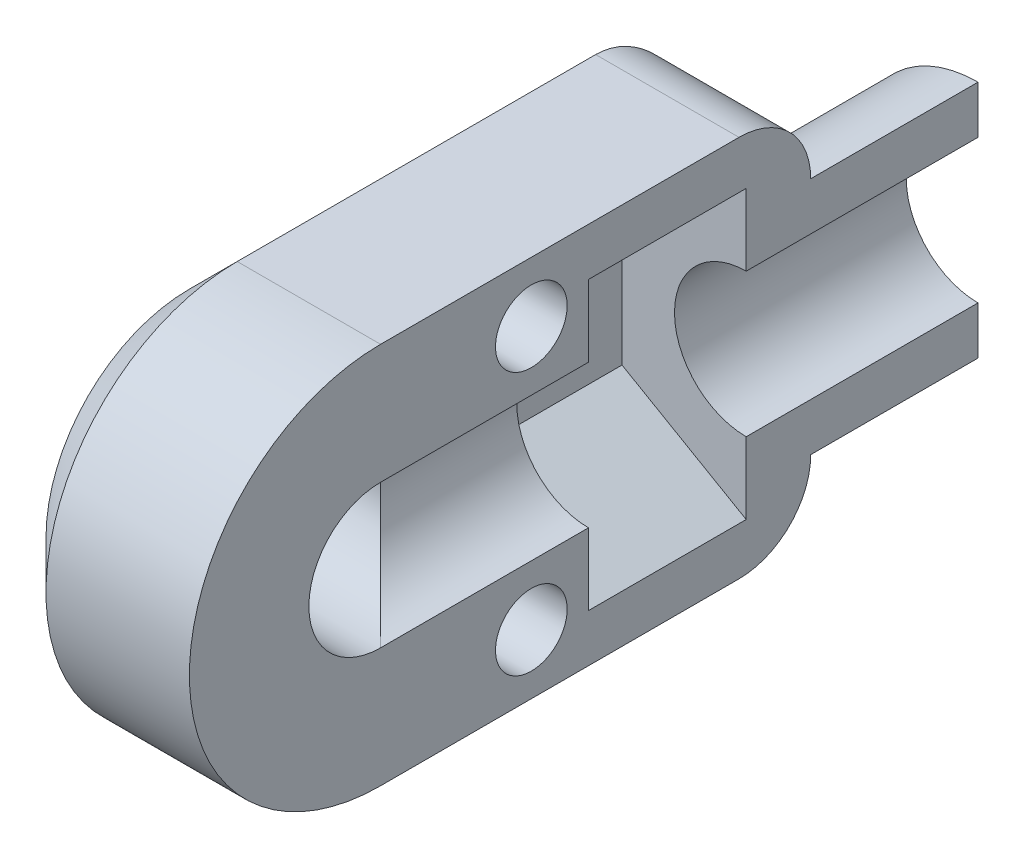
ISO-10303-21;
HEADER;
FILE_DESCRIPTION(('STEP AP214'),'2;1');
FILE_NAME('part.step','',(''),(''),'','','');
FILE_SCHEMA(('AUTOMOTIVE_DESIGN { 1 0 10303 214 1 1 1 1 }'));
ENDSEC;
DATA;
#1=APPLICATION_CONTEXT('core data for automotive mechanical design processes');
#2=APPLICATION_PROTOCOL_DEFINITION('international standard','automotive_design',2000,#1);
#3=PRODUCT_CONTEXT('',#1,'mechanical');
#4=PRODUCT('Part','Part','',(#3));
#5=PRODUCT_RELATED_PRODUCT_CATEGORY('part','',(#4));
#6=PRODUCT_DEFINITION_FORMATION('','',#4);
#7=PRODUCT_DEFINITION_CONTEXT('part definition',#1,'design');
#8=PRODUCT_DEFINITION('design','',#6,#7);
#9=PRODUCT_DEFINITION_SHAPE('','',#8);
#10=(LENGTH_UNIT() NAMED_UNIT(*) SI_UNIT(.MILLI.,.METRE.));
#11=(NAMED_UNIT(*) PLANE_ANGLE_UNIT() SI_UNIT($,.RADIAN.));
#12=(NAMED_UNIT(*) SI_UNIT($,.STERADIAN.) SOLID_ANGLE_UNIT());
#13=UNCERTAINTY_MEASURE_WITH_UNIT(LENGTH_MEASURE(1.E-05),#10,'distance_accuracy_value','');
#14=(GEOMETRIC_REPRESENTATION_CONTEXT(3) GLOBAL_UNCERTAINTY_ASSIGNED_CONTEXT((#13)) GLOBAL_UNIT_ASSIGNED_CONTEXT((#10,
#11,#12)) REPRESENTATION_CONTEXT('',''));
#15=CARTESIAN_POINT('',(0.,0.,0.));
#16=DIRECTION('',(0.,0.,1.));
#17=DIRECTION('',(1.,0.,0.));
#18=AXIS2_PLACEMENT_3D('',#15,#16,#17);
#19=CARTESIAN_POINT('',(0.,0.,-18.));
#20=DIRECTION('',(0.,0.,-1.));
#21=DIRECTION('',(-1.,0.,0.));
#22=AXIS2_PLACEMENT_3D('',#19,#20,#21);
#23=PLANE('',#22);
#24=CARTESIAN_POINT('',(8.,0.,-18.));
#25=DIRECTION('',(0.,0.,-1.));
#26=DIRECTION('',(-1.,0.,0.));
#27=AXIS2_PLACEMENT_3D('',#24,#25,#26);
#28=CIRCLE('',#27,5.);
#29=CARTESIAN_POINT('',(8.,-5.,-18.));
#30=VERTEX_POINT('',#29);
#31=CARTESIAN_POINT('',(3.,0.,-18.));
#32=VERTEX_POINT('',#31);
#33=EDGE_CURVE('E202',#30,#32,#28,.T.);
#34=ORIENTED_EDGE('',*,*,#33,.F.);
#35=DIRECTION('',(-1.,0.,0.));
#36=VECTOR('',#35,1.);
#37=CARTESIAN_POINT('',(2.,-5.,-18.));
#38=LINE('',#37,#36);
#39=CARTESIAN_POINT('',(3.24264068711929,-5.,-18.));
#40=VERTEX_POINT('',#39);
#41=EDGE_CURVE('E221',#30,#40,#38,.T.);
#42=ORIENTED_EDGE('',*,*,#41,.T.);
#43=DIRECTION('',(0.707106781186546,-0.707106781186549,0.));
#44=VECTOR('',#43,1.);
#45=CARTESIAN_POINT('',(-0.878679656440352,-0.878679656440349,-18.));
#46=LINE('',#45,#44);
#47=CARTESIAN_POINT('',(3.,-4.75735931288071,-18.));
#48=VERTEX_POINT('',#47);
#49=EDGE_CURVE('E369',#40,#48,#46,.F.);
#50=ORIENTED_EDGE('',*,*,#49,.T.);
#51=DIRECTION('',(0.,1.,0.));
#52=VECTOR('',#51,1.);
#53=CARTESIAN_POINT('',(3.,5.99999999999999,-18.));
#54=LINE('',#53,#52);
#55=EDGE_CURVE('E367',#48,#32,#54,.T.);
#56=ORIENTED_EDGE('',*,*,#55,.T.);
#57=EDGE_LOOP('',(#34,#42,#50,#56));
#58=FACE_BOUND('',#57,.T.);
#59=ADVANCED_FACE('F41',(#58),#23,.T.);
#60=CARTESIAN_POINT('',(16.,-8.,0.));
#61=DIRECTION('',(0.,1.,0.));
#62=DIRECTION('',(0.,0.,1.));
#63=AXIS2_PLACEMENT_3D('',#60,#61,#62);
#64=PLANE('',#63);
#65=DIRECTION('',(0.,0.,-1.));
#66=VECTOR('',#65,1.);
#67=CARTESIAN_POINT('',(2.,-8.,0.));
#68=LINE('',#67,#66);
#69=CARTESIAN_POINT('',(2.,-8.,0.));
#70=VERTEX_POINT('',#69);
#71=CARTESIAN_POINT('',(2.,-8.,-15.));
#72=VERTEX_POINT('',#71);
#73=EDGE_CURVE('E332',#70,#72,#68,.T.);
#74=ORIENTED_EDGE('',*,*,#73,.T.);
#75=DIRECTION('',(-1.,0.,0.));
#76=VECTOR('',#75,1.);
#77=CARTESIAN_POINT('',(8.,-8.,-15.));
#78=LINE('',#77,#76);
#79=CARTESIAN_POINT('',(8.,-8.,-15.));
#80=VERTEX_POINT('',#79);
#81=EDGE_CURVE('E217',#72,#80,#78,.F.);
#82=ORIENTED_EDGE('',*,*,#81,.T.);
#83=DIRECTION('',(0.,0.,1.));
#84=VECTOR('',#83,1.);
#85=CARTESIAN_POINT('',(8.,-8.,0.));
#86=LINE('',#85,#84);
#87=CARTESIAN_POINT('',(8.,-8.,0.));
#88=VERTEX_POINT('',#87);
#89=EDGE_CURVE('E300',#80,#88,#86,.T.);
#90=ORIENTED_EDGE('',*,*,#89,.T.);
#91=DIRECTION('',(-1.,0.,0.));
#92=VECTOR('',#91,1.);
#93=CARTESIAN_POINT('',(16.,-8.,0.));
#94=LINE('',#93,#92);
#95=EDGE_CURVE('E319',#88,#70,#94,.T.);
#96=ORIENTED_EDGE('',*,*,#95,.T.);
#97=EDGE_LOOP('',(#74,#82,#90,#96));
#98=FACE_BOUND('',#97,.T.);
#99=ADVANCED_FACE('F393',(#98),#64,.F.);
#100=CARTESIAN_POINT('',(16.,0.,-25.));
#101=DIRECTION('',(0.,0.,-1.));
#102=DIRECTION('',(-1.,0.,0.));
#103=AXIS2_PLACEMENT_3D('',#100,#101,#102);
#104=PLANE('',#103);
#105=DIRECTION('',(0.,1.,0.));
#106=VECTOR('',#105,1.);
#107=CARTESIAN_POINT('',(8.,-48.,-25.));
#108=LINE('',#107,#106);
#109=CARTESIAN_POINT('',(8.,-5.,-25.));
#110=VERTEX_POINT('',#109);
#111=CARTESIAN_POINT('',(8.,-3.,-25.));
#112=VERTEX_POINT('',#111);
#113=EDGE_CURVE('E296',#110,#112,#108,.T.);
#114=ORIENTED_EDGE('',*,*,#113,.F.);
#115=CARTESIAN_POINT('',(8.,0.,-25.));
#116=DIRECTION('',(0.,0.,-1.));
#117=DIRECTION('',(-1.,0.,0.));
#118=AXIS2_PLACEMENT_3D('',#115,#116,#117);
#119=CIRCLE('',#118,5.);
#120=CARTESIAN_POINT('',(8.,5.,-25.));
#121=VERTEX_POINT('',#120);
#122=EDGE_CURVE('E204',#110,#121,#119,.T.);
#123=ORIENTED_EDGE('',*,*,#122,.T.);
#124=CARTESIAN_POINT('',(8.,3.,-25.));
#125=VERTEX_POINT('',#124);
#126=EDGE_CURVE('E212',#125,#121,#108,.T.);
#127=ORIENTED_EDGE('',*,*,#126,.F.);
#128=CARTESIAN_POINT('',(8.,0.,-25.));
#129=DIRECTION('',(0.,0.,-1.));
#130=DIRECTION('',(-1.,0.,0.));
#131=AXIS2_PLACEMENT_3D('',#128,#129,#130);
#132=CIRCLE('',#131,3.);
#133=EDGE_CURVE('E306',#112,#125,#132,.T.);
#134=ORIENTED_EDGE('',*,*,#133,.F.);
#135=EDGE_LOOP('',(#114,#123,#127,#134));
#136=FACE_BOUND('',#135,.T.);
#137=ADVANCED_FACE('F398',(#136),#104,.T.);
#138=CARTESIAN_POINT('',(16.,8.,0.));
#139=DIRECTION('',(0.,1.,0.));
#140=DIRECTION('',(0.,0.,1.));
#141=AXIS2_PLACEMENT_3D('',#138,#139,#140);
#142=PLANE('',#141);
#143=DIRECTION('',(0.,0.,1.));
#144=VECTOR('',#143,1.);
#145=CARTESIAN_POINT('',(8.,8.,-25.));
#146=LINE('',#145,#144);
#147=CARTESIAN_POINT('',(8.,8.,-15.));
#148=VERTEX_POINT('',#147);
#149=CARTESIAN_POINT('',(8.,8.,0.));
#150=VERTEX_POINT('',#149);
#151=EDGE_CURVE('E293',#148,#150,#146,.T.);
#152=ORIENTED_EDGE('',*,*,#151,.F.);
#153=DIRECTION('',(1.,0.,0.));
#154=VECTOR('',#153,1.);
#155=CARTESIAN_POINT('',(16.,8.,-15.));
#156=LINE('',#155,#154);
#157=CARTESIAN_POINT('',(2.,8.,-15.));
#158=VERTEX_POINT('',#157);
#159=EDGE_CURVE('E11',#148,#158,#156,.F.);
#160=ORIENTED_EDGE('',*,*,#159,.T.);
#161=DIRECTION('',(0.,0.,1.));
#162=VECTOR('',#161,1.);
#163=CARTESIAN_POINT('',(2.,8.,0.));
#164=LINE('',#163,#162);
#165=CARTESIAN_POINT('',(2.,8.,0.));
#166=VERTEX_POINT('',#165);
#167=EDGE_CURVE('E330',#158,#166,#164,.T.);
#168=ORIENTED_EDGE('',*,*,#167,.T.);
#169=DIRECTION('',(-1.,0.,0.));
#170=VECTOR('',#169,1.);
#171=CARTESIAN_POINT('',(16.,8.,0.));
#172=LINE('',#171,#170);
#173=EDGE_CURVE('E315',#150,#166,#172,.T.);
#174=ORIENTED_EDGE('',*,*,#173,.F.);
#175=EDGE_LOOP('',(#152,#160,#168,#174));
#176=FACE_BOUND('',#175,.T.);
#177=ADVANCED_FACE('F467',(#176),#142,.T.);
#178=CARTESIAN_POINT('',(0.,0.,0.));
#179=DIRECTION('',(1.,0.,0.));
#180=DIRECTION('',(0.,0.,-1.));
#181=AXIS2_PLACEMENT_3D('',#178,#179,#180);
#182=PLANE('',#181);
#183=CARTESIAN_POINT('',(0.,0.,0.));
#184=DIRECTION('',(1.,0.,0.));
#185=DIRECTION('',(0.,0.,-1.));
#186=AXIS2_PLACEMENT_3D('',#183,#184,#185);
#187=CIRCLE('',#186,3.);
#188=CARTESIAN_POINT('',(0.,0.,-3.));
#189=VERTEX_POINT('',#188);
#190=EDGE_CURVE('E312',#189,#189,#187,.T.);
#191=ORIENTED_EDGE('',*,*,#190,.T.);
#192=EDGE_LOOP('',(#191));
#193=FACE_BOUND('',#192,.T.);
#194=DIRECTION('',(0.,0.,-1.));
#195=VECTOR('',#194,1.);
#196=CARTESIAN_POINT('',(0.,5.99999999999999,-25.));
#197=LINE('',#196,#195);
#198=CARTESIAN_POINT('',(0.,5.99999999999999,-8.24543648007678));
#199=VERTEX_POINT('',#198);
#200=CARTESIAN_POINT('',(0.,5.99999999999999,-15.));
#201=VERTEX_POINT('',#200);
#202=EDGE_CURVE('E326',#199,#201,#197,.T.);
#203=ORIENTED_EDGE('',*,*,#202,.T.);
#204=DIRECTION('',(0.,1.,0.));
#205=VECTOR('',#204,1.);
#206=CARTESIAN_POINT('',(0.,-5.99999999999999,-15.));
#207=LINE('',#206,#205);
#208=CARTESIAN_POINT('',(0.,-5.99999999999999,-15.));
#209=VERTEX_POINT('',#208);
#210=EDGE_CURVE('E226',#201,#209,#207,.F.);
#211=ORIENTED_EDGE('',*,*,#210,.T.);
#212=DIRECTION('',(0.,0.,1.));
#213=VECTOR('',#212,1.);
#214=CARTESIAN_POINT('',(0.,-5.99999999999999,0.));
#215=LINE('',#214,#213);
#216=CARTESIAN_POINT('',(0.,-5.99999999999999,-8.24543648007678));
#217=VERTEX_POINT('',#216);
#218=EDGE_CURVE('E324',#209,#217,#215,.T.);
#219=ORIENTED_EDGE('',*,*,#218,.T.);
#220=CARTESIAN_POINT('',(0.,-5.5,-6.30894480697307));
#221=DIRECTION('',(-1.,0.,0.));
#222=DIRECTION('',(0.,0.,-1.));
#223=AXIS2_PLACEMENT_3D('',#220,#221,#222);
#224=CIRCLE('',#223,2.);
#225=CARTESIAN_POINT('',(0.,-5.99999999999999,-4.37245313386936));
#226=VERTEX_POINT('',#225);
#227=EDGE_CURVE('E213',#226,#217,#224,.T.);
#228=ORIENTED_EDGE('',*,*,#227,.F.);
#229=CARTESIAN_POINT('',(0.,-5.99999999999999,0.));
#230=VERTEX_POINT('',#229);
#231=EDGE_CURVE('E323',#226,#230,#215,.T.);
#232=ORIENTED_EDGE('',*,*,#231,.T.);
#233=CARTESIAN_POINT('',(0.,0.,0.));
#234=DIRECTION('',(1.,0.,0.));
#235=DIRECTION('',(0.,0.,-1.));
#236=AXIS2_PLACEMENT_3D('',#233,#234,#235);
#237=CIRCLE('',#236,5.99999999999999);
#238=CARTESIAN_POINT('',(0.,5.99999999999999,0.));
#239=VERTEX_POINT('',#238);
#240=EDGE_CURVE('E321',#230,#239,#237,.F.);
#241=ORIENTED_EDGE('',*,*,#240,.T.);
#242=CARTESIAN_POINT('',(0.,5.99999999999999,-4.37245313386936));
#243=VERTEX_POINT('',#242);
#244=EDGE_CURVE('E327',#239,#243,#197,.T.);
#245=ORIENTED_EDGE('',*,*,#244,.T.);
#246=CARTESIAN_POINT('',(0.,5.5,-6.30894480697307));
#247=DIRECTION('',(-1.,0.,0.));
#248=DIRECTION('',(0.,0.,1.));
#249=AXIS2_PLACEMENT_3D('',#246,#247,#248);
#250=CIRCLE('',#249,2.);
#251=EDGE_CURVE('E249',#199,#243,#250,.T.);
#252=ORIENTED_EDGE('',*,*,#251,.F.);
#253=EDGE_LOOP('',(#203,#211,#219,#228,#232,#241,#245,#252));
#254=FACE_BOUND('',#253,.T.);
#255=ADVANCED_FACE('F463',(#193,#254),#182,.F.);
#256=CARTESIAN_POINT('',(2.,-8.,0.));
#257=DIRECTION('',(0.707106781186549,0.707106781186546,0.));
#258=DIRECTION('',(0.,0.,-1.));
#259=AXIS2_PLACEMENT_3D('',#256,#257,#258);
#260=PLANE('',#259);
#261=ORIENTED_EDGE('',*,*,#218,.F.);
#262=DIRECTION('',(-0.707106781186546,0.707106781186549,0.));
#263=VECTOR('',#262,1.);
#264=CARTESIAN_POINT('',(2.,-8.,-15.));
#265=LINE('',#264,#263);
#266=EDGE_CURVE('E219',#209,#72,#265,.F.);
#267=ORIENTED_EDGE('',*,*,#266,.T.);
#268=ORIENTED_EDGE('',*,*,#73,.F.);
#269=DIRECTION('',(0.707106781186546,-0.707106781186549,0.));
#270=VECTOR('',#269,1.);
#271=CARTESIAN_POINT('',(0.,-5.99999999999999,0.));
#272=LINE('',#271,#270);
#273=EDGE_CURVE('E316',#230,#70,#272,.T.);
#274=ORIENTED_EDGE('',*,*,#273,.F.);
#275=ORIENTED_EDGE('',*,*,#231,.F.);
#276=CARTESIAN_POINT('',(-0.49999999999999,-5.5,-6.30894480697307));
#277=DIRECTION('',(0.707106781186549,0.707106781186546,0.));
#278=DIRECTION('',(-0.707106781186546,0.707106781186549,0.));
#279=AXIS2_PLACEMENT_3D('',#276,#277,#278);
#280=ELLIPSE('',#279,2.82842712474619,2.);
#281=EDGE_CURVE('E193',#217,#226,#280,.F.);
#282=ORIENTED_EDGE('',*,*,#281,.F.);
#283=EDGE_LOOP('',(#261,#267,#268,#274,#275,#282));
#284=FACE_BOUND('',#283,.T.);
#285=ADVANCED_FACE('F466',(#284),#260,.F.);
#286=CARTESIAN_POINT('',(0.,5.99999999999999,0.));
#287=DIRECTION('',(-0.707106781186549,0.707106781186546,0.));
#288=DIRECTION('',(0.,0.,1.));
#289=AXIS2_PLACEMENT_3D('',#286,#287,#288);
#290=PLANE('',#289);
#291=ORIENTED_EDGE('',*,*,#167,.F.);
#292=DIRECTION('',(0.707106781186546,0.707106781186549,0.));
#293=VECTOR('',#292,1.);
#294=CARTESIAN_POINT('',(0.,5.99999999999999,-15.));
#295=LINE('',#294,#293);
#296=EDGE_CURVE('E50',#158,#201,#295,.F.);
#297=ORIENTED_EDGE('',*,*,#296,.T.);
#298=ORIENTED_EDGE('',*,*,#202,.F.);
#299=CARTESIAN_POINT('',(-0.49999999999999,5.5,-6.30894480697307));
#300=DIRECTION('',(-0.707106781186549,0.707106781186546,0.));
#301=DIRECTION('',(-0.707106781186546,-0.707106781186549,0.));
#302=AXIS2_PLACEMENT_3D('',#299,#300,#301);
#303=ELLIPSE('',#302,2.82842712474619,2.);
#304=EDGE_CURVE('E361',#243,#199,#303,.T.);
#305=ORIENTED_EDGE('',*,*,#304,.F.);
#306=ORIENTED_EDGE('',*,*,#244,.F.);
#307=DIRECTION('',(0.707106781186546,0.707106781186549,0.));
#308=VECTOR('',#307,1.);
#309=CARTESIAN_POINT('',(0.,5.99999999999999,0.));
#310=LINE('',#309,#308);
#311=EDGE_CURVE('E309',#239,#166,#310,.T.);
#312=ORIENTED_EDGE('',*,*,#311,.T.);
#313=EDGE_LOOP('',(#291,#297,#298,#305,#306,#312));
#314=FACE_BOUND('',#313,.T.);
#315=ADVANCED_FACE('F457',(#314),#290,.T.);
#316=CARTESIAN_POINT('',(8.,-48.,-25.));
#317=DIRECTION('',(-1.,0.,0.));
#318=DIRECTION('',(0.,0.,1.));
#319=AXIS2_PLACEMENT_3D('',#316,#317,#318);
#320=PLANE('',#319);
#321=CARTESIAN_POINT('',(8.,5.5,-6.30894480697307));
#322=DIRECTION('',(1.,0.,0.));
#323=DIRECTION('',(0.,0.,-1.));
#324=AXIS2_PLACEMENT_3D('',#321,#322,#323);
#325=CIRCLE('',#324,1.5);
#326=CARTESIAN_POINT('',(8.,5.5,-7.80894480697307));
#327=VERTEX_POINT('',#326);
#328=EDGE_CURVE('E256',#327,#327,#325,.T.);
#329=ORIENTED_EDGE('',*,*,#328,.F.);
#330=EDGE_LOOP('',(#329));
#331=FACE_BOUND('',#330,.T.);
#332=CARTESIAN_POINT('',(8.,-5.5,-6.30894480697307));
#333=DIRECTION('',(1.,0.,0.));
#334=DIRECTION('',(0.,0.,1.));
#335=AXIS2_PLACEMENT_3D('',#332,#333,#334);
#336=CIRCLE('',#335,1.5);
#337=CARTESIAN_POINT('',(8.,-5.5,-7.80894480697307));
#338=VERTEX_POINT('',#337);
#339=EDGE_CURVE('E260',#338,#338,#336,.T.);
#340=ORIENTED_EDGE('',*,*,#339,.F.);
#341=EDGE_LOOP('',(#340));
#342=FACE_BOUND('',#341,.T.);
#343=ORIENTED_EDGE('',*,*,#89,.F.);
#344=CARTESIAN_POINT('',(8.,-5.,-15.));
#345=DIRECTION('',(-1.,0.,0.));
#346=DIRECTION('',(0.,0.,1.));
#347=AXIS2_PLACEMENT_3D('',#344,#345,#346);
#348=CIRCLE('',#347,3.);
#349=EDGE_CURVE('E216',#80,#30,#348,.F.);
#350=ORIENTED_EDGE('',*,*,#349,.T.);
#351=DIRECTION('',(0.,0.,-1.));
#352=VECTOR('',#351,1.);
#353=CARTESIAN_POINT('',(8.,-5.,-18.));
#354=LINE('',#353,#352);
#355=EDGE_CURVE('E214',#30,#110,#354,.T.);
#356=ORIENTED_EDGE('',*,*,#355,.T.);
#357=ORIENTED_EDGE('',*,*,#113,.T.);
#358=DIRECTION('',(0.,0.,-1.));
#359=VECTOR('',#358,1.);
#360=CARTESIAN_POINT('',(8.,-3.,8.001));
#361=LINE('',#360,#359);
#362=CARTESIAN_POINT('',(8.,-3.,-15.3));
#363=VERTEX_POINT('',#362);
#364=EDGE_CURVE('E338',#363,#112,#361,.T.);
#365=ORIENTED_EDGE('',*,*,#364,.F.);
#366=DIRECTION('',(0.,1.,0.));
#367=VECTOR('',#366,1.);
#368=CARTESIAN_POINT('',(8.,-48.,-15.3));
#369=LINE('',#368,#367);
#370=CARTESIAN_POINT('',(8.,-6.,-15.3));
#371=VERTEX_POINT('',#370);
#372=EDGE_CURVE('E352',#371,#363,#369,.T.);
#373=ORIENTED_EDGE('',*,*,#372,.F.);
#374=DIRECTION('',(0.,0.,-1.));
#375=VECTOR('',#374,1.);
#376=CARTESIAN_POINT('',(8.,-6.,-8.7));
#377=LINE('',#376,#375);
#378=CARTESIAN_POINT('',(8.,-6.,-8.7));
#379=VERTEX_POINT('',#378);
#380=EDGE_CURVE('E279',#379,#371,#377,.T.);
#381=ORIENTED_EDGE('',*,*,#380,.F.);
#382=DIRECTION('',(0.,1.,0.));
#383=VECTOR('',#382,1.);
#384=CARTESIAN_POINT('',(8.,-48.,-8.7));
#385=LINE('',#384,#383);
#386=CARTESIAN_POINT('',(8.,-3.,-8.7));
#387=VERTEX_POINT('',#386);
#388=EDGE_CURVE('E356',#379,#387,#385,.T.);
#389=ORIENTED_EDGE('',*,*,#388,.T.);
#390=CARTESIAN_POINT('',(8.,-3.,0.));
#391=VERTEX_POINT('',#390);
#392=EDGE_CURVE('E343',#391,#387,#361,.T.);
#393=ORIENTED_EDGE('',*,*,#392,.F.);
#394=CARTESIAN_POINT('',(8.,0.,0.));
#395=DIRECTION('',(-1.,0.,0.));
#396=DIRECTION('',(0.,0.,1.));
#397=AXIS2_PLACEMENT_3D('',#394,#395,#396);
#398=CIRCLE('',#397,3.);
#399=CARTESIAN_POINT('',(8.,3.,0.));
#400=VERTEX_POINT('',#399);
#401=EDGE_CURVE('E297',#391,#400,#398,.T.);
#402=ORIENTED_EDGE('',*,*,#401,.T.);
#403=DIRECTION('',(0.,0.,-1.));
#404=VECTOR('',#403,1.);
#405=CARTESIAN_POINT('',(8.,3.,8.001));
#406=LINE('',#405,#404);
#407=CARTESIAN_POINT('',(8.,3.,-8.7));
#408=VERTEX_POINT('',#407);
#409=EDGE_CURVE('E346',#408,#400,#406,.F.);
#410=ORIENTED_EDGE('',*,*,#409,.F.);
#411=CARTESIAN_POINT('',(8.,6.,-8.7));
#412=VERTEX_POINT('',#411);
#413=EDGE_CURVE('E353',#408,#412,#385,.T.);
#414=ORIENTED_EDGE('',*,*,#413,.T.);
#415=DIRECTION('',(0.,0.,-1.));
#416=VECTOR('',#415,1.);
#417=CARTESIAN_POINT('',(8.,6.,-8.7));
#418=LINE('',#417,#416);
#419=CARTESIAN_POINT('',(8.,6.,-15.3));
#420=VERTEX_POINT('',#419);
#421=EDGE_CURVE('E285',#412,#420,#418,.T.);
#422=ORIENTED_EDGE('',*,*,#421,.T.);
#423=CARTESIAN_POINT('',(8.,3.,-15.3));
#424=VERTEX_POINT('',#423);
#425=EDGE_CURVE('E350',#424,#420,#369,.T.);
#426=ORIENTED_EDGE('',*,*,#425,.F.);
#427=EDGE_CURVE('E347',#125,#424,#406,.F.);
#428=ORIENTED_EDGE('',*,*,#427,.F.);
#429=ORIENTED_EDGE('',*,*,#126,.T.);
#430=DIRECTION('',(0.,0.,-1.));
#431=VECTOR('',#430,1.);
#432=CARTESIAN_POINT('',(8.,5.,-18.));
#433=LINE('',#432,#431);
#434=CARTESIAN_POINT('',(8.,5.,-18.));
#435=VERTEX_POINT('',#434);
#436=EDGE_CURVE('E198',#435,#121,#433,.T.);
#437=ORIENTED_EDGE('',*,*,#436,.F.);
#438=CARTESIAN_POINT('',(8.,5.,-15.));
#439=DIRECTION('',(-1.,0.,0.));
#440=DIRECTION('',(0.,0.,1.));
#441=AXIS2_PLACEMENT_3D('',#438,#439,#440);
#442=CIRCLE('',#441,3.);
#443=EDGE_CURVE('E210',#435,#148,#442,.F.);
#444=ORIENTED_EDGE('',*,*,#443,.T.);
#445=ORIENTED_EDGE('',*,*,#151,.T.);
#446=CARTESIAN_POINT('',(8.,0.,0.));
#447=DIRECTION('',(-1.,0.,0.));
#448=DIRECTION('',(0.,0.,1.));
#449=AXIS2_PLACEMENT_3D('',#446,#447,#448);
#450=CIRCLE('',#449,8.);
#451=EDGE_CURVE('E302',#88,#150,#450,.T.);
#452=ORIENTED_EDGE('',*,*,#451,.F.);
#453=EDGE_LOOP('',(#343,#350,#356,#357,#365,#373,#381,#389,#393,#402,#410,#414,#422,#426,#428,
#429,#437,#444,#445,#452));
#454=FACE_BOUND('',#453,.T.);
#455=ADVANCED_FACE('F209',(#331,#342,#454),#320,.F.);
#456=CARTESIAN_POINT('',(-2.3,5.5,-6.30894480697307));
#457=DIRECTION('',(1.,0.,0.));
#458=DIRECTION('',(0.,0.,-1.));
#459=AXIS2_PLACEMENT_3D('',#456,#457,#458);
#460=CYLINDRICAL_SURFACE('',#459,1.5);
#461=CARTESIAN_POINT('',(2.,5.5,-6.30894480697307));
#462=DIRECTION('',(-1.,0.,0.));
#463=DIRECTION('',(0.,0.,1.));
#464=AXIS2_PLACEMENT_3D('',#461,#462,#463);
#465=CIRCLE('',#464,1.5);
#466=CARTESIAN_POINT('',(2.,5.5,-7.80894480697307));
#467=VERTEX_POINT('',#466);
#468=EDGE_CURVE('E248',#467,#467,#465,.F.);
#469=CARTESIAN_POINT('',(8.,5.5,-7.80894480697307));
#470=CARTESIAN_POINT('',(7.9375,5.5,-7.80894480697307));
#471=CARTESIAN_POINT('',(7.875,5.5,-7.80894480697307));
#472=CARTESIAN_POINT('',(7.75,5.5,-7.80894480697307));
#473=CARTESIAN_POINT('',(7.6875,5.5,-7.80894480697307));
#474=CARTESIAN_POINT('',(7.5625,5.5,-7.80894480697307));
#475=CARTESIAN_POINT('',(7.5,5.5,-7.80894480697307));
#476=CARTESIAN_POINT('',(7.375,5.5,-7.80894480697307));
#477=CARTESIAN_POINT('',(7.3125,5.5,-7.80894480697307));
#478=CARTESIAN_POINT('',(7.1875,5.5,-7.80894480697307));
#479=CARTESIAN_POINT('',(7.125,5.5,-7.80894480697307));
#480=CARTESIAN_POINT('',(7.,5.5,-7.80894480697307));
#481=CARTESIAN_POINT('',(6.9375,5.5,-7.80894480697307));
#482=CARTESIAN_POINT('',(6.8125,5.5,-7.80894480697307));
#483=CARTESIAN_POINT('',(6.75,5.5,-7.80894480697307));
#484=CARTESIAN_POINT('',(6.625,5.5,-7.80894480697307));
#485=CARTESIAN_POINT('',(6.5625,5.5,-7.80894480697307));
#486=CARTESIAN_POINT('',(6.4375,5.5,-7.80894480697307));
#487=CARTESIAN_POINT('',(6.375,5.5,-7.80894480697307));
#488=CARTESIAN_POINT('',(6.25,5.5,-7.80894480697307));
#489=CARTESIAN_POINT('',(6.1875,5.5,-7.80894480697307));
#490=CARTESIAN_POINT('',(6.0625,5.5,-7.80894480697307));
#491=CARTESIAN_POINT('',(6.,5.5,-7.80894480697307));
#492=CARTESIAN_POINT('',(5.875,5.5,-7.80894480697307));
#493=CARTESIAN_POINT('',(5.8125,5.5,-7.80894480697307));
#494=CARTESIAN_POINT('',(5.6875,5.5,-7.80894480697307));
#495=CARTESIAN_POINT('',(5.625,5.5,-7.80894480697307));
#496=CARTESIAN_POINT('',(5.5,5.5,-7.80894480697307));
#497=CARTESIAN_POINT('',(5.4375,5.5,-7.80894480697307));
#498=CARTESIAN_POINT('',(5.3125,5.5,-7.80894480697307));
#499=CARTESIAN_POINT('',(5.25,5.5,-7.80894480697307));
#500=CARTESIAN_POINT('',(5.125,5.5,-7.80894480697307));
#501=CARTESIAN_POINT('',(5.0625,5.5,-7.80894480697307));
#502=CARTESIAN_POINT('',(4.9375,5.5,-7.80894480697307));
#503=CARTESIAN_POINT('',(4.875,5.5,-7.80894480697307));
#504=CARTESIAN_POINT('',(4.75,5.5,-7.80894480697307));
#505=CARTESIAN_POINT('',(4.6875,5.5,-7.80894480697307));
#506=CARTESIAN_POINT('',(4.5625,5.5,-7.80894480697307));
#507=CARTESIAN_POINT('',(4.5,5.5,-7.80894480697307));
#508=CARTESIAN_POINT('',(4.375,5.5,-7.80894480697307));
#509=CARTESIAN_POINT('',(4.3125,5.5,-7.80894480697307));
#510=CARTESIAN_POINT('',(4.1875,5.5,-7.80894480697307));
#511=CARTESIAN_POINT('',(4.125,5.5,-7.80894480697307));
#512=CARTESIAN_POINT('',(4.,5.5,-7.80894480697307));
#513=CARTESIAN_POINT('',(3.9375,5.5,-7.80894480697307));
#514=CARTESIAN_POINT('',(3.8125,5.5,-7.80894480697307));
#515=CARTESIAN_POINT('',(3.75,5.5,-7.80894480697307));
#516=CARTESIAN_POINT('',(3.625,5.5,-7.80894480697307));
#517=CARTESIAN_POINT('',(3.5625,5.5,-7.80894480697307));
#518=CARTESIAN_POINT('',(3.4375,5.5,-7.80894480697307));
#519=CARTESIAN_POINT('',(3.375,5.5,-7.80894480697307));
#520=CARTESIAN_POINT('',(3.25,5.5,-7.80894480697307));
#521=CARTESIAN_POINT('',(3.1875,5.5,-7.80894480697307));
#522=CARTESIAN_POINT('',(3.0625,5.5,-7.80894480697307));
#523=CARTESIAN_POINT('',(3.,5.5,-7.80894480697307));
#524=CARTESIAN_POINT('',(2.875,5.5,-7.80894480697307));
#525=CARTESIAN_POINT('',(2.8125,5.5,-7.80894480697307));
#526=CARTESIAN_POINT('',(2.6875,5.5,-7.80894480697307));
#527=CARTESIAN_POINT('',(2.625,5.5,-7.80894480697307));
#528=CARTESIAN_POINT('',(2.5,5.5,-7.80894480697307));
#529=CARTESIAN_POINT('',(2.4375,5.5,-7.80894480697307));
#530=CARTESIAN_POINT('',(2.3125,5.5,-7.80894480697307));
#531=CARTESIAN_POINT('',(2.25,5.5,-7.80894480697307));
#532=CARTESIAN_POINT('',(2.125,5.5,-7.80894480697307));
#533=CARTESIAN_POINT('',(2.0625,5.5,-7.80894480697307));
#534=CARTESIAN_POINT('',(2.,5.5,-7.80894480697307));
#535=B_SPLINE_CURVE_WITH_KNOTS('',3,(#469,#470,#471,#472,#473,#474,#475,#476,#477,#478,#479,
#480,#481,#482,#483,#484,#485,#486,#487,#488,#489,#490,#491,#492,#493,#494,#495,#496,#497,#498,
#499,#500,#501,#502,#503,#504,#505,#506,#507,#508,#509,#510,#511,#512,#513,#514,#515,#516,#517,
#518,#519,#520,#521,#522,#523,#524,#525,#526,#527,#528,#529,#530,#531,#532,#533,#534),
.UNSPECIFIED.,.F.,.F.,(4,2,2,2,2,2,2,2,2,2,2,2,2,2,2,2,2,2,2,2,2,2,2,2,2,2,2,2,2,2,2,2,4),(0.,
0.1875,0.375,0.5625,0.749999999999999,0.937499999999999,1.125,1.3125,1.5,1.6875,1.875,2.0625,
2.25,2.4375,2.625,2.8125,3.,3.1875,3.375,3.5625,3.75,3.9375,4.125,4.3125,4.5,4.6875,4.875,
5.0625,5.25,5.4375,5.625,5.8125,6.),.UNSPECIFIED.);
#536=EDGE_CURVE('BSEAM426',#327,#467,#535,.T.);
#537=ORIENTED_EDGE('',*,*,#328,.T.);
#538=ORIENTED_EDGE('',*,*,#468,.F.);
#539=ORIENTED_EDGE('',*,*,#536,.T.);
#540=ORIENTED_EDGE('',*,*,#536,.F.);
#541=EDGE_LOOP('',(#537,#539,#538,#540));
#542=FACE_BOUND('',#541,.T.);
#543=ADVANCED_FACE('F426',(#542),#460,.F.);
#544=CARTESIAN_POINT('',(8.,0.,8.001));
#545=DIRECTION('',(0.,0.,-1.));
#546=DIRECTION('',(-1.,0.,0.));
#547=AXIS2_PLACEMENT_3D('',#544,#545,#546);
#548=CYLINDRICAL_SURFACE('',#547,3.);
#549=CARTESIAN_POINT('',(8.,0.,-15.3));
#550=DIRECTION('',(0.,0.,1.));
#551=DIRECTION('',(1.,0.,0.));
#552=AXIS2_PLACEMENT_3D('',#549,#550,#551);
#553=CIRCLE('',#552,3.);
#554=EDGE_CURVE('E288',#363,#424,#553,.F.);
#555=ORIENTED_EDGE('',*,*,#554,.F.);
#556=ORIENTED_EDGE('',*,*,#364,.T.);
#557=ORIENTED_EDGE('',*,*,#133,.T.);
#558=ORIENTED_EDGE('',*,*,#427,.T.);
#559=EDGE_LOOP('',(#555,#556,#557,#558));
#560=FACE_BOUND('',#559,.T.);
#561=ADVANCED_FACE('F429',(#560),#548,.F.);
#562=CARTESIAN_POINT('',(16.,0.,0.));
#563=DIRECTION('',(-1.,0.,0.));
#564=DIRECTION('',(0.,0.,1.));
#565=AXIS2_PLACEMENT_3D('',#562,#563,#564);
#566=CYLINDRICAL_SURFACE('',#565,8.);
#567=ORIENTED_EDGE('',*,*,#95,.F.);
#568=ORIENTED_EDGE('',*,*,#451,.T.);
#569=ORIENTED_EDGE('',*,*,#173,.T.);
#570=CARTESIAN_POINT('',(2.,0.,0.));
#571=DIRECTION('',(1.,0.,0.));
#572=DIRECTION('',(0.,0.,-1.));
#573=AXIS2_PLACEMENT_3D('',#570,#571,#572);
#574=CIRCLE('',#573,8.);
#575=EDGE_CURVE('E335',#166,#70,#574,.T.);
#576=ORIENTED_EDGE('',*,*,#575,.T.);
#577=EDGE_LOOP('',(#567,#568,#569,#576));
#578=FACE_BOUND('',#577,.T.);
#579=ADVANCED_FACE('F472',(#578),#566,.T.);
#580=CARTESIAN_POINT('',(16.,0.,0.));
#581=DIRECTION('',(-1.,0.,0.));
#582=DIRECTION('',(0.,0.,1.));
#583=AXIS2_PLACEMENT_3D('',#580,#581,#582);
#584=CYLINDRICAL_SURFACE('',#583,3.);
#585=ORIENTED_EDGE('',*,*,#401,.F.);
#586=CARTESIAN_POINT('',(8.,0.,0.));
#587=DIRECTION('',(0.707106781186547,0.,-0.707106781186547));
#588=DIRECTION('',(-0.707106781186547,0.,-0.707106781186547));
#589=AXIS2_PLACEMENT_3D('',#586,#587,#588);
#590=ELLIPSE('',#589,4.24264068711929,3.);
#591=EDGE_CURVE('E305',#391,#400,#590,.T.);
#592=ORIENTED_EDGE('',*,*,#591,.T.);
#593=EDGE_LOOP('',(#585,#592));
#594=FACE_BOUND('',#593,.T.);
#595=ORIENTED_EDGE('',*,*,#190,.F.);
#596=EDGE_LOOP('',(#595));
#597=FACE_BOUND('',#596,.T.);
#598=ADVANCED_FACE('F469',(#594,#597),#584,.F.);
#599=CARTESIAN_POINT('',(2.,0.,0.));
#600=DIRECTION('',(1.,0.,0.));
#601=DIRECTION('',(0.,0.,-1.));
#602=AXIS2_PLACEMENT_3D('',#599,#600,#601);
#603=CONICAL_SURFACE('',#602,8.,0.78539816339745);
#604=ORIENTED_EDGE('',*,*,#273,.T.);
#605=ORIENTED_EDGE('',*,*,#575,.F.);
#606=ORIENTED_EDGE('',*,*,#311,.F.);
#607=ORIENTED_EDGE('',*,*,#240,.F.);
#608=EDGE_LOOP('',(#604,#605,#606,#607));
#609=FACE_BOUND('',#608,.T.);
#610=ADVANCED_FACE('F461',(#609),#603,.T.);
#611=ORIENTED_EDGE('',*,*,#392,.T.);
#612=CARTESIAN_POINT('',(8.,0.,-8.7));
#613=DIRECTION('',(0.,0.,1.));
#614=DIRECTION('',(1.,0.,0.));
#615=AXIS2_PLACEMENT_3D('',#612,#613,#614);
#616=CIRCLE('',#615,3.);
#617=EDGE_CURVE('E290',#387,#408,#616,.F.);
#618=ORIENTED_EDGE('',*,*,#617,.T.);
#619=ORIENTED_EDGE('',*,*,#409,.T.);
#620=ORIENTED_EDGE('',*,*,#591,.F.);
#621=EDGE_LOOP('',(#611,#618,#619,#620));
#622=FACE_BOUND('',#621,.T.);
#623=ADVANCED_FACE('F443',(#622),#548,.F.);
#624=CARTESIAN_POINT('',(0.,0.,-8.7));
#625=DIRECTION('',(0.,0.,1.));
#626=DIRECTION('',(1.,0.,0.));
#627=AXIS2_PLACEMENT_3D('',#624,#625,#626);
#628=PLANE('',#627);
#629=DIRECTION('',(0.866025403784439,-0.5,0.));
#630=VECTOR('',#629,1.);
#631=CARTESIAN_POINT('',(2.80384757729337,-3.,-8.7));
#632=LINE('',#631,#630);
#633=CARTESIAN_POINT('',(2.80384757729337,-3.,-8.7));
#634=VERTEX_POINT('',#633);
#635=EDGE_CURVE('E276',#634,#379,#632,.T.);
#636=ORIENTED_EDGE('',*,*,#635,.F.);
#637=DIRECTION('',(0.,-1.,0.));
#638=VECTOR('',#637,1.);
#639=CARTESIAN_POINT('',(2.80384757729337,3.,-8.7));
#640=LINE('',#639,#638);
#641=CARTESIAN_POINT('',(2.80384757729337,3.,-8.7));
#642=VERTEX_POINT('',#641);
#643=EDGE_CURVE('E274',#642,#634,#640,.T.);
#644=ORIENTED_EDGE('',*,*,#643,.F.);
#645=DIRECTION('',(-0.866025403784439,-0.5,0.));
#646=VECTOR('',#645,1.);
#647=CARTESIAN_POINT('',(8.,6.,-8.7));
#648=LINE('',#647,#646);
#649=EDGE_CURVE('E272',#412,#642,#648,.T.);
#650=ORIENTED_EDGE('',*,*,#649,.F.);
#651=ORIENTED_EDGE('',*,*,#413,.F.);
#652=ORIENTED_EDGE('',*,*,#617,.F.);
#653=ORIENTED_EDGE('',*,*,#388,.F.);
#654=EDGE_LOOP('',(#636,#644,#650,#651,#652,#653));
#655=FACE_BOUND('',#654,.T.);
#656=ADVANCED_FACE('F439',(#655),#628,.F.);
#657=CARTESIAN_POINT('',(0.,0.,-15.3));
#658=DIRECTION('',(0.,0.,1.));
#659=DIRECTION('',(1.,0.,0.));
#660=AXIS2_PLACEMENT_3D('',#657,#658,#659);
#661=PLANE('',#660);
#662=ORIENTED_EDGE('',*,*,#372,.T.);
#663=ORIENTED_EDGE('',*,*,#554,.T.);
#664=ORIENTED_EDGE('',*,*,#425,.T.);
#665=DIRECTION('',(-0.866025403784439,-0.5,0.));
#666=VECTOR('',#665,1.);
#667=CARTESIAN_POINT('',(8.,6.,-15.3));
#668=LINE('',#667,#666);
#669=CARTESIAN_POINT('',(2.80384757729337,3.,-15.3));
#670=VERTEX_POINT('',#669);
#671=EDGE_CURVE('E259',#420,#670,#668,.T.);
#672=ORIENTED_EDGE('',*,*,#671,.T.);
#673=DIRECTION('',(0.,-1.,0.));
#674=VECTOR('',#673,1.);
#675=CARTESIAN_POINT('',(2.80384757729337,3.,-15.3));
#676=LINE('',#675,#674);
#677=CARTESIAN_POINT('',(2.80384757729337,-3.,-15.3));
#678=VERTEX_POINT('',#677);
#679=EDGE_CURVE('E266',#670,#678,#676,.T.);
#680=ORIENTED_EDGE('',*,*,#679,.T.);
#681=DIRECTION('',(0.866025403784439,-0.5,0.));
#682=VECTOR('',#681,1.);
#683=CARTESIAN_POINT('',(2.80384757729337,-3.,-15.3));
#684=LINE('',#683,#682);
#685=EDGE_CURVE('E269',#678,#371,#684,.T.);
#686=ORIENTED_EDGE('',*,*,#685,.T.);
#687=EDGE_LOOP('',(#662,#663,#664,#672,#680,#686));
#688=FACE_BOUND('',#687,.T.);
#689=ADVANCED_FACE('F435',(#688),#661,.T.);
#690=CARTESIAN_POINT('',(8.,6.,-8.7));
#691=DIRECTION('',(0.5,-0.866025403784439,0.));
#692=DIRECTION('',(0.866025403784439,0.5,0.));
#693=AXIS2_PLACEMENT_3D('',#690,#691,#692);
#694=PLANE('',#693);
#695=ORIENTED_EDGE('',*,*,#421,.F.);
#696=ORIENTED_EDGE('',*,*,#649,.T.);
#697=DIRECTION('',(0.,0.,-1.));
#698=VECTOR('',#697,1.);
#699=CARTESIAN_POINT('',(2.80384757729337,3.,-8.7));
#700=LINE('',#699,#698);
#701=EDGE_CURVE('E283',#642,#670,#700,.T.);
#702=ORIENTED_EDGE('',*,*,#701,.T.);
#703=ORIENTED_EDGE('',*,*,#671,.F.);
#704=EDGE_LOOP('',(#695,#696,#702,#703));
#705=FACE_BOUND('',#704,.T.);
#706=ADVANCED_FACE('F438',(#705),#694,.T.);
#707=CARTESIAN_POINT('',(2.80384757729337,3.,-8.7));
#708=DIRECTION('',(1.,0.,0.));
#709=DIRECTION('',(0.,0.,-1.));
#710=AXIS2_PLACEMENT_3D('',#707,#708,#709);
#711=PLANE('',#710);
#712=ORIENTED_EDGE('',*,*,#701,.F.);
#713=ORIENTED_EDGE('',*,*,#643,.T.);
#714=DIRECTION('',(0.,0.,-1.));
#715=VECTOR('',#714,1.);
#716=CARTESIAN_POINT('',(2.80384757729337,-3.,-8.7));
#717=LINE('',#716,#715);
#718=EDGE_CURVE('E281',#634,#678,#717,.T.);
#719=ORIENTED_EDGE('',*,*,#718,.T.);
#720=ORIENTED_EDGE('',*,*,#679,.F.);
#721=EDGE_LOOP('',(#712,#713,#719,#720));
#722=FACE_BOUND('',#721,.T.);
#723=ADVANCED_FACE('F447',(#722),#711,.T.);
#724=CARTESIAN_POINT('',(2.80384757729337,-3.,-8.7));
#725=DIRECTION('',(0.5,0.866025403784439,0.));
#726=DIRECTION('',(-0.866025403784439,0.5,0.));
#727=AXIS2_PLACEMENT_3D('',#724,#725,#726);
#728=PLANE('',#727);
#729=ORIENTED_EDGE('',*,*,#718,.F.);
#730=ORIENTED_EDGE('',*,*,#635,.T.);
#731=ORIENTED_EDGE('',*,*,#380,.T.);
#732=ORIENTED_EDGE('',*,*,#685,.F.);
#733=EDGE_LOOP('',(#729,#730,#731,#732));
#734=FACE_BOUND('',#733,.T.);
#735=ADVANCED_FACE('F433',(#734),#728,.T.);
#736=CARTESIAN_POINT('',(-2.3,-5.5,-6.30894480697307));
#737=DIRECTION('',(1.,0.,0.));
#738=DIRECTION('',(0.,0.,-1.));
#739=AXIS2_PLACEMENT_3D('',#736,#737,#738);
#740=CYLINDRICAL_SURFACE('',#739,1.5);
#741=CARTESIAN_POINT('',(2.,-5.5,-6.30894480697307));
#742=DIRECTION('',(1.,0.,0.));
#743=DIRECTION('',(0.,0.,-1.));
#744=AXIS2_PLACEMENT_3D('',#741,#742,#743);
#745=CIRCLE('',#744,1.5);
#746=CARTESIAN_POINT('',(2.,-5.5,-7.80894480697307));
#747=VERTEX_POINT('',#746);
#748=EDGE_CURVE('E263',#747,#747,#745,.F.);
#749=CARTESIAN_POINT('',(2.,-5.5,-7.80894480697307));
#750=CARTESIAN_POINT('',(2.0625,-5.5,-7.80894480697307));
#751=CARTESIAN_POINT('',(2.125,-5.5,-7.80894480697307));
#752=CARTESIAN_POINT('',(2.25,-5.5,-7.80894480697307));
#753=CARTESIAN_POINT('',(2.3125,-5.5,-7.80894480697307));
#754=CARTESIAN_POINT('',(2.4375,-5.5,-7.80894480697307));
#755=CARTESIAN_POINT('',(2.5,-5.5,-7.80894480697307));
#756=CARTESIAN_POINT('',(2.625,-5.5,-7.80894480697307));
#757=CARTESIAN_POINT('',(2.6875,-5.5,-7.80894480697307));
#758=CARTESIAN_POINT('',(2.8125,-5.5,-7.80894480697307));
#759=CARTESIAN_POINT('',(2.875,-5.5,-7.80894480697307));
#760=CARTESIAN_POINT('',(3.,-5.5,-7.80894480697307));
#761=CARTESIAN_POINT('',(3.0625,-5.5,-7.80894480697307));
#762=CARTESIAN_POINT('',(3.1875,-5.5,-7.80894480697307));
#763=CARTESIAN_POINT('',(3.25,-5.5,-7.80894480697307));
#764=CARTESIAN_POINT('',(3.375,-5.5,-7.80894480697307));
#765=CARTESIAN_POINT('',(3.4375,-5.5,-7.80894480697307));
#766=CARTESIAN_POINT('',(3.5625,-5.5,-7.80894480697307));
#767=CARTESIAN_POINT('',(3.625,-5.5,-7.80894480697307));
#768=CARTESIAN_POINT('',(3.75,-5.5,-7.80894480697307));
#769=CARTESIAN_POINT('',(3.8125,-5.5,-7.80894480697307));
#770=CARTESIAN_POINT('',(3.9375,-5.5,-7.80894480697307));
#771=CARTESIAN_POINT('',(4.,-5.5,-7.80894480697307));
#772=CARTESIAN_POINT('',(4.125,-5.5,-7.80894480697307));
#773=CARTESIAN_POINT('',(4.1875,-5.5,-7.80894480697307));
#774=CARTESIAN_POINT('',(4.3125,-5.5,-7.80894480697307));
#775=CARTESIAN_POINT('',(4.375,-5.5,-7.80894480697307));
#776=CARTESIAN_POINT('',(4.5,-5.5,-7.80894480697307));
#777=CARTESIAN_POINT('',(4.5625,-5.5,-7.80894480697307));
#778=CARTESIAN_POINT('',(4.6875,-5.5,-7.80894480697307));
#779=CARTESIAN_POINT('',(4.75,-5.5,-7.80894480697307));
#780=CARTESIAN_POINT('',(4.875,-5.5,-7.80894480697307));
#781=CARTESIAN_POINT('',(4.9375,-5.5,-7.80894480697307));
#782=CARTESIAN_POINT('',(5.0625,-5.5,-7.80894480697307));
#783=CARTESIAN_POINT('',(5.125,-5.5,-7.80894480697307));
#784=CARTESIAN_POINT('',(5.25,-5.5,-7.80894480697307));
#785=CARTESIAN_POINT('',(5.3125,-5.5,-7.80894480697307));
#786=CARTESIAN_POINT('',(5.4375,-5.5,-7.80894480697307));
#787=CARTESIAN_POINT('',(5.5,-5.5,-7.80894480697307));
#788=CARTESIAN_POINT('',(5.625,-5.5,-7.80894480697307));
#789=CARTESIAN_POINT('',(5.6875,-5.5,-7.80894480697307));
#790=CARTESIAN_POINT('',(5.8125,-5.5,-7.80894480697307));
#791=CARTESIAN_POINT('',(5.875,-5.5,-7.80894480697307));
#792=CARTESIAN_POINT('',(6.,-5.5,-7.80894480697307));
#793=CARTESIAN_POINT('',(6.0625,-5.5,-7.80894480697307));
#794=CARTESIAN_POINT('',(6.1875,-5.5,-7.80894480697307));
#795=CARTESIAN_POINT('',(6.25,-5.5,-7.80894480697307));
#796=CARTESIAN_POINT('',(6.375,-5.5,-7.80894480697307));
#797=CARTESIAN_POINT('',(6.4375,-5.5,-7.80894480697307));
#798=CARTESIAN_POINT('',(6.5625,-5.5,-7.80894480697307));
#799=CARTESIAN_POINT('',(6.625,-5.5,-7.80894480697307));
#800=CARTESIAN_POINT('',(6.75,-5.5,-7.80894480697307));
#801=CARTESIAN_POINT('',(6.8125,-5.5,-7.80894480697307));
#802=CARTESIAN_POINT('',(6.9375,-5.5,-7.80894480697307));
#803=CARTESIAN_POINT('',(7.,-5.5,-7.80894480697307));
#804=CARTESIAN_POINT('',(7.125,-5.5,-7.80894480697307));
#805=CARTESIAN_POINT('',(7.1875,-5.5,-7.80894480697307));
#806=CARTESIAN_POINT('',(7.3125,-5.5,-7.80894480697307));
#807=CARTESIAN_POINT('',(7.375,-5.5,-7.80894480697307));
#808=CARTESIAN_POINT('',(7.5,-5.5,-7.80894480697307));
#809=CARTESIAN_POINT('',(7.5625,-5.5,-7.80894480697307));
#810=CARTESIAN_POINT('',(7.6875,-5.5,-7.80894480697307));
#811=CARTESIAN_POINT('',(7.75,-5.5,-7.80894480697307));
#812=CARTESIAN_POINT('',(7.875,-5.5,-7.80894480697307));
#813=CARTESIAN_POINT('',(7.9375,-5.5,-7.80894480697307));
#814=CARTESIAN_POINT('',(8.,-5.5,-7.80894480697307));
#815=B_SPLINE_CURVE_WITH_KNOTS('',3,(#749,#750,#751,#752,#753,#754,#755,#756,#757,#758,#759,
#760,#761,#762,#763,#764,#765,#766,#767,#768,#769,#770,#771,#772,#773,#774,#775,#776,#777,#778,
#779,#780,#781,#782,#783,#784,#785,#786,#787,#788,#789,#790,#791,#792,#793,#794,#795,#796,#797,
#798,#799,#800,#801,#802,#803,#804,#805,#806,#807,#808,#809,#810,#811,#812,#813,#814),
.UNSPECIFIED.,.F.,.F.,(4,2,2,2,2,2,2,2,2,2,2,2,2,2,2,2,2,2,2,2,2,2,2,2,2,2,2,2,2,2,2,2,4),(0.,
0.1875,0.375,0.5625,0.75,0.9375,1.125,1.3125,1.5,1.6875,1.875,2.0625,2.25,2.4375,2.625,2.8125,
3.,3.1875,3.375,3.5625,3.75,3.9375,4.125,4.3125,4.5,4.6875,4.875,5.0625,5.25,5.4375,5.625,
5.8125,6.),.UNSPECIFIED.);
#816=EDGE_CURVE('BSEAM418',#747,#338,#815,.T.);
#817=ORIENTED_EDGE('',*,*,#748,.T.);
#818=ORIENTED_EDGE('',*,*,#339,.T.);
#819=ORIENTED_EDGE('',*,*,#816,.T.);
#820=ORIENTED_EDGE('',*,*,#816,.F.);
#821=EDGE_LOOP('',(#817,#819,#818,#820));
#822=FACE_BOUND('',#821,.T.);
#823=ADVANCED_FACE('F418',(#822),#740,.F.);
#824=CARTESIAN_POINT('',(2.,5.5,-6.30894480697307));
#825=DIRECTION('',(-1.,0.,0.));
#826=DIRECTION('',(0.,0.,1.));
#827=AXIS2_PLACEMENT_3D('',#824,#825,#826);
#828=PLANE('',#827);
#829=CARTESIAN_POINT('',(2.,5.5,-6.30894480697307));
#830=DIRECTION('',(-1.,0.,0.));
#831=DIRECTION('',(0.,0.,1.));
#832=AXIS2_PLACEMENT_3D('',#829,#830,#831);
#833=CIRCLE('',#832,2.);
#834=CARTESIAN_POINT('',(2.,5.5,-4.30894480697307));
#835=VERTEX_POINT('',#834);
#836=EDGE_CURVE('E245',#835,#835,#833,.T.);
#837=ORIENTED_EDGE('',*,*,#836,.T.);
#838=EDGE_LOOP('',(#837));
#839=FACE_BOUND('',#838,.T.);
#840=ORIENTED_EDGE('',*,*,#468,.T.);
#841=EDGE_LOOP('',(#840));
#842=FACE_BOUND('',#841,.T.);
#843=ADVANCED_FACE('F414',(#839,#842),#828,.T.);
#844=CARTESIAN_POINT('',(2.,5.5,-6.30894480697307));
#845=DIRECTION('',(-1.,0.,0.));
#846=DIRECTION('',(0.,0.,1.));
#847=AXIS2_PLACEMENT_3D('',#844,#845,#846);
#848=CYLINDRICAL_SURFACE('',#847,2.);
#849=ORIENTED_EDGE('',*,*,#304,.T.);
#850=ORIENTED_EDGE('',*,*,#251,.T.);
#851=EDGE_LOOP('',(#849,#850));
#852=FACE_BOUND('',#851,.T.);
#853=ORIENTED_EDGE('',*,*,#836,.F.);
#854=EDGE_LOOP('',(#853));
#855=FACE_BOUND('',#854,.T.);
#856=ADVANCED_FACE('F417',(#852,#855),#848,.F.);
#857=CARTESIAN_POINT('',(2.,-5.5,-6.30894480697307));
#858=DIRECTION('',(1.,0.,0.));
#859=DIRECTION('',(0.,0.,-1.));
#860=AXIS2_PLACEMENT_3D('',#857,#858,#859);
#861=PLANE('',#860);
#862=CARTESIAN_POINT('',(2.,-5.5,-6.30894480697307));
#863=DIRECTION('',(-1.,0.,0.));
#864=DIRECTION('',(0.,0.,-1.));
#865=AXIS2_PLACEMENT_3D('',#862,#863,#864);
#866=CIRCLE('',#865,2.);
#867=CARTESIAN_POINT('',(2.,-5.5,-8.30894480697307));
#868=VERTEX_POINT('',#867);
#869=EDGE_CURVE('E251',#868,#868,#866,.T.);
#870=ORIENTED_EDGE('',*,*,#869,.T.);
#871=EDGE_LOOP('',(#870));
#872=FACE_BOUND('',#871,.T.);
#873=ORIENTED_EDGE('',*,*,#748,.F.);
#874=EDGE_LOOP('',(#873));
#875=FACE_BOUND('',#874,.T.);
#876=ADVANCED_FACE('F410',(#872,#875),#861,.F.);
#877=CARTESIAN_POINT('',(2.,-5.5,-6.30894480697307));
#878=DIRECTION('',(-1.,0.,0.));
#879=DIRECTION('',(0.,0.,1.));
#880=AXIS2_PLACEMENT_3D('',#877,#878,#879);
#881=CYLINDRICAL_SURFACE('',#880,2.);
#882=ORIENTED_EDGE('',*,*,#281,.T.);
#883=ORIENTED_EDGE('',*,*,#227,.T.);
#884=EDGE_LOOP('',(#882,#883));
#885=FACE_BOUND('',#884,.T.);
#886=ORIENTED_EDGE('',*,*,#869,.F.);
#887=EDGE_LOOP('',(#886));
#888=FACE_BOUND('',#887,.T.);
#889=ADVANCED_FACE('F406',(#885,#888),#881,.F.);
#890=CARTESIAN_POINT('',(8.,0.,-18.));
#891=DIRECTION('',(0.,0.,-1.));
#892=DIRECTION('',(-1.,0.,0.));
#893=AXIS2_PLACEMENT_3D('',#890,#891,#892);
#894=CYLINDRICAL_SURFACE('',#893,5.);
#895=ORIENTED_EDGE('',*,*,#122,.F.);
#896=ORIENTED_EDGE('',*,*,#355,.F.);
#897=ORIENTED_EDGE('',*,*,#33,.T.);
#898=EDGE_CURVE('E185',#32,#435,#28,.T.);
#899=ORIENTED_EDGE('',*,*,#898,.T.);
#900=ORIENTED_EDGE('',*,*,#436,.T.);
#901=EDGE_LOOP('',(#895,#896,#897,#899,#900));
#902=FACE_BOUND('',#901,.T.);
#903=ADVANCED_FACE('F197',(#902),#894,.T.);
#904=ORIENTED_EDGE('',*,*,#898,.F.);
#905=DIRECTION('',(0.,1.,0.));
#906=VECTOR('',#905,1.);
#907=CARTESIAN_POINT('',(3.,5.99999999999999,-18.));
#908=LINE('',#907,#906);
#909=CARTESIAN_POINT('',(3.,4.75735931288071,-18.));
#910=VERTEX_POINT('',#909);
#911=EDGE_CURVE('E365',#32,#910,#908,.T.);
#912=ORIENTED_EDGE('',*,*,#911,.T.);
#913=DIRECTION('',(0.707106781186546,0.707106781186549,0.));
#914=VECTOR('',#913,1.);
#915=CARTESIAN_POINT('',(-0.878679656440352,0.878679656440349,-18.));
#916=LINE('',#915,#914);
#917=CARTESIAN_POINT('',(3.24264068711929,5.,-18.));
#918=VERTEX_POINT('',#917);
#919=EDGE_CURVE('E188',#910,#918,#916,.T.);
#920=ORIENTED_EDGE('',*,*,#919,.T.);
#921=DIRECTION('',(1.,0.,0.));
#922=VECTOR('',#921,1.);
#923=CARTESIAN_POINT('',(0.,5.,-18.));
#924=LINE('',#923,#922);
#925=EDGE_CURVE('E182',#918,#435,#924,.T.);
#926=ORIENTED_EDGE('',*,*,#925,.T.);
#927=EDGE_LOOP('',(#904,#912,#920,#926));
#928=FACE_BOUND('',#927,.T.);
#929=ADVANCED_FACE('F184',(#928),#23,.T.);
#930=CARTESIAN_POINT('',(0.,5.,-15.));
#931=DIRECTION('',(1.,0.,0.));
#932=DIRECTION('',(0.,0.,-1.));
#933=AXIS2_PLACEMENT_3D('',#930,#931,#932);
#934=CYLINDRICAL_SURFACE('',#933,3.);
#935=ORIENTED_EDGE('',*,*,#443,.F.);
#936=ORIENTED_EDGE('',*,*,#925,.F.);
#937=CARTESIAN_POINT('',(3.24264068711929,5.,-15.));
#938=DIRECTION('',(0.923879532511287,0.382683432365091,0.));
#939=DIRECTION('',(0.382683432365091,-0.923879532511287,0.));
#940=AXIS2_PLACEMENT_3D('',#937,#938,#939);
#941=ELLIPSE('',#940,3.24717660087718,3.);
#942=EDGE_CURVE('E45',#158,#918,#941,.F.);
#943=ORIENTED_EDGE('',*,*,#942,.F.);
#944=ORIENTED_EDGE('',*,*,#159,.F.);
#945=EDGE_LOOP('',(#935,#936,#943,#944));
#946=FACE_BOUND('',#945,.T.);
#947=ADVANCED_FACE('F43',(#946),#934,.T.);
#948=CARTESIAN_POINT('',(-0.878679656440351,0.878679656440348,-15.));
#949=DIRECTION('',(0.707106781186546,0.707106781186549,0.));
#950=DIRECTION('',(-0.707106781186549,0.707106781186546,0.));
#951=AXIS2_PLACEMENT_3D('',#948,#949,#950);
#952=CYLINDRICAL_SURFACE('',#951,3.);
#953=ORIENTED_EDGE('',*,*,#942,.T.);
#954=ORIENTED_EDGE('',*,*,#919,.F.);
#955=CARTESIAN_POINT('',(3.,4.75735931288071,-15.));
#956=DIRECTION('',(0.382683432365089,0.923879532511287,0.));
#957=DIRECTION('',(0.923879532511287,-0.382683432365089,0.));
#958=AXIS2_PLACEMENT_3D('',#955,#956,#957);
#959=ELLIPSE('',#958,3.24717660087718,3.);
#960=EDGE_CURVE('E233',#201,#910,#959,.F.);
#961=ORIENTED_EDGE('',*,*,#960,.F.);
#962=ORIENTED_EDGE('',*,*,#296,.F.);
#963=EDGE_LOOP('',(#953,#954,#961,#962));
#964=FACE_BOUND('',#963,.T.);
#965=ADVANCED_FACE('F385',(#964),#952,.T.);
#966=CARTESIAN_POINT('',(3.,0.,-15.));
#967=DIRECTION('',(0.,-1.,0.));
#968=DIRECTION('',(0.,0.,-1.));
#969=AXIS2_PLACEMENT_3D('',#966,#967,#968);
#970=CYLINDRICAL_SURFACE('',#969,3.);
#971=ORIENTED_EDGE('',*,*,#911,.F.);
#972=ORIENTED_EDGE('',*,*,#55,.F.);
#973=CARTESIAN_POINT('',(3.,-4.75735931288071,-15.));
#974=DIRECTION('',(0.382683432365089,-0.923879532511287,0.));
#975=DIRECTION('',(-0.923879532511287,-0.382683432365089,0.));
#976=AXIS2_PLACEMENT_3D('',#973,#974,#975);
#977=ELLIPSE('',#976,3.24717660087718,3.);
#978=EDGE_CURVE('E231',#209,#48,#977,.T.);
#979=ORIENTED_EDGE('',*,*,#978,.F.);
#980=ORIENTED_EDGE('',*,*,#210,.F.);
#981=ORIENTED_EDGE('',*,*,#960,.T.);
#982=EDGE_LOOP('',(#971,#972,#979,#980,#981));
#983=FACE_BOUND('',#982,.T.);
#984=ADVANCED_FACE('F384',(#983),#970,.T.);
#985=CARTESIAN_POINT('',(-0.878679656440352,-0.878679656440349,-15.));
#986=DIRECTION('',(0.707106781186546,-0.707106781186549,0.));
#987=DIRECTION('',(0.707106781186549,0.707106781186546,0.));
#988=AXIS2_PLACEMENT_3D('',#985,#986,#987);
#989=CYLINDRICAL_SURFACE('',#988,3.);
#990=ORIENTED_EDGE('',*,*,#978,.T.);
#991=ORIENTED_EDGE('',*,*,#49,.F.);
#992=CARTESIAN_POINT('',(3.24264068711929,-5.,-15.));
#993=DIRECTION('',(0.923879532511287,-0.382683432365091,0.));
#994=DIRECTION('',(-0.382683432365091,-0.923879532511287,0.));
#995=AXIS2_PLACEMENT_3D('',#992,#993,#994);
#996=ELLIPSE('',#995,3.24717660087718,3.);
#997=EDGE_CURVE('E229',#72,#40,#996,.T.);
#998=ORIENTED_EDGE('',*,*,#997,.F.);
#999=ORIENTED_EDGE('',*,*,#266,.F.);
#1000=EDGE_LOOP('',(#990,#991,#998,#999));
#1001=FACE_BOUND('',#1000,.T.);
#1002=ADVANCED_FACE('F382',(#1001),#989,.T.);
#1003=CARTESIAN_POINT('',(0.,-5.,-15.));
#1004=DIRECTION('',(1.,0.,0.));
#1005=DIRECTION('',(0.,0.,-1.));
#1006=AXIS2_PLACEMENT_3D('',#1003,#1004,#1005);
#1007=CYLINDRICAL_SURFACE('',#1006,3.);
#1008=ORIENTED_EDGE('',*,*,#349,.F.);
#1009=ORIENTED_EDGE('',*,*,#81,.F.);
#1010=ORIENTED_EDGE('',*,*,#997,.T.);
#1011=ORIENTED_EDGE('',*,*,#41,.F.);
#1012=EDGE_LOOP('',(#1008,#1009,#1010,#1011));
#1013=FACE_BOUND('',#1012,.T.);
#1014=ADVANCED_FACE('F377',(#1013),#1007,.T.);
#1015=CLOSED_SHELL('',(#59,#99,#137,#177,#255,#285,#315,#455,#543,#561,#579,#598,#610,#623,#656,
#689,#706,#723,#735,#823,#843,#856,#876,#889,#903,#929,#947,#965,#984,#1002,#1014));
#1016=MANIFOLD_SOLID_BREP('B2',#1015);
#1017=ADVANCED_BREP_SHAPE_REPRESENTATION('',(#18,#1016),#14);
#1018=SHAPE_DEFINITION_REPRESENTATION(#9,#1017);
ENDSEC;
END-ISO-10303-21;
